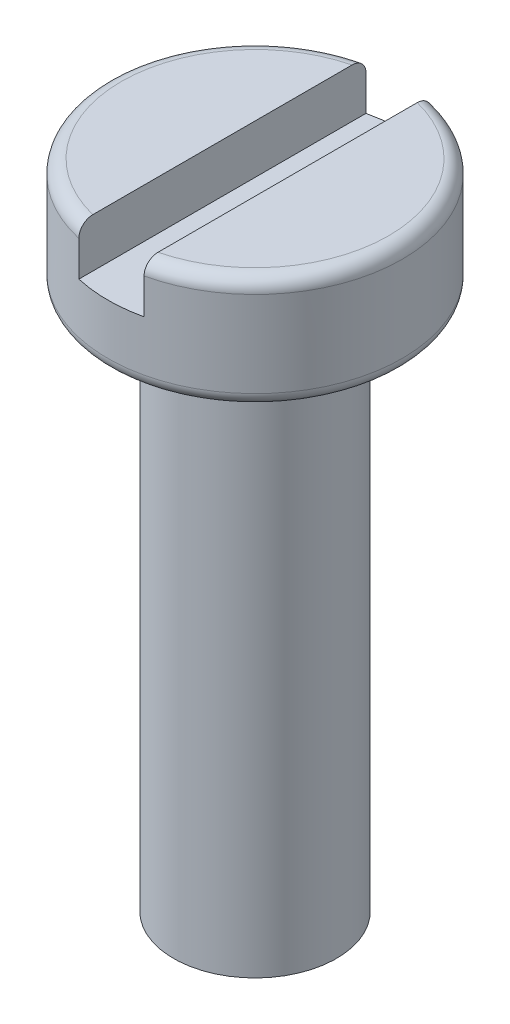
ISO-10303-21;
HEADER;
FILE_DESCRIPTION(('STEP AP214'),'2;1');
FILE_NAME('part.step','',(''),(''),'','','');
FILE_SCHEMA(('AUTOMOTIVE_DESIGN { 1 0 10303 214 1 1 1 1 }'));
ENDSEC;
DATA;
#1=APPLICATION_CONTEXT('core data for automotive mechanical design processes');
#2=APPLICATION_PROTOCOL_DEFINITION('international standard','automotive_design',2000,#1);
#3=PRODUCT_CONTEXT('',#1,'mechanical');
#4=PRODUCT('Part','Part','',(#3));
#5=PRODUCT_RELATED_PRODUCT_CATEGORY('part','',(#4));
#6=PRODUCT_DEFINITION_FORMATION('','',#4);
#7=PRODUCT_DEFINITION_CONTEXT('part definition',#1,'design');
#8=PRODUCT_DEFINITION('design','',#6,#7);
#9=PRODUCT_DEFINITION_SHAPE('','',#8);
#10=(LENGTH_UNIT() NAMED_UNIT(*) SI_UNIT(.MILLI.,.METRE.));
#11=(NAMED_UNIT(*) PLANE_ANGLE_UNIT() SI_UNIT($,.RADIAN.));
#12=(NAMED_UNIT(*) SI_UNIT($,.STERADIAN.) SOLID_ANGLE_UNIT());
#13=UNCERTAINTY_MEASURE_WITH_UNIT(LENGTH_MEASURE(1.E-05),#10,'distance_accuracy_value','');
#14=(GEOMETRIC_REPRESENTATION_CONTEXT(3) GLOBAL_UNCERTAINTY_ASSIGNED_CONTEXT((#13)) GLOBAL_UNIT_ASSIGNED_CONTEXT((#10,
#11,#12)) REPRESENTATION_CONTEXT('',''));
#15=CARTESIAN_POINT('',(0.,0.,0.));
#16=DIRECTION('',(0.,0.,1.));
#17=DIRECTION('',(1.,0.,0.));
#18=AXIS2_PLACEMENT_3D('',#15,#16,#17);
#19=CARTESIAN_POINT('',(0.,20.,0.));
#20=DIRECTION('',(0.,-1.,0.));
#21=DIRECTION('',(0.,0.,-1.));
#22=AXIS2_PLACEMENT_3D('',#19,#20,#21);
#23=PLANE('',#22);
#24=CARTESIAN_POINT('',(0.,20.,0.));
#25=DIRECTION('',(0.,-1.,0.));
#26=DIRECTION('',(0.,0.,-1.));
#27=AXIS2_PLACEMENT_3D('',#24,#25,#26);
#28=CIRCLE('',#27,2.46);
#29=CARTESIAN_POINT('',(-0.6,20.,-2.38570744224846));
#30=VERTEX_POINT('',#29);
#31=CARTESIAN_POINT('',(-0.6,20.,2.3857074422486));
#32=VERTEX_POINT('',#31);
#33=EDGE_CURVE('E104',#30,#32,#28,.F.);
#34=ORIENTED_EDGE('',*,*,#33,.T.);
#35=DIRECTION('',(0.,0.,1.));
#36=VECTOR('',#35,1.);
#37=CARTESIAN_POINT('',(-0.6,20.,2.71102334228302));
#38=LINE('',#37,#36);
#39=EDGE_CURVE('E101',#30,#32,#38,.T.);
#40=ORIENTED_EDGE('',*,*,#39,.F.);
#41=EDGE_LOOP('',(#34,#40));
#42=FACE_BOUND('',#41,.T.);
#43=ADVANCED_FACE('F35',(#42),#23,.F.);
#44=CARTESIAN_POINT('',(0.,19.75,0.));
#45=DIRECTION('',(0.,-1.,0.));
#46=DIRECTION('',(0.,0.,-1.));
#47=AXIS2_PLACEMENT_3D('',#44,#45,#46);
#48=TOROIDAL_SURFACE('',#47,2.46,0.25);
#49=CARTESIAN_POINT('',(-0.6,19.9057779269637,2.58686231688076));
#50=CARTESIAN_POINT('',(-0.6,19.8950398183509,2.5956435679496));
#51=CARTESIAN_POINT('',(-0.6,19.8835649113459,2.60353742344512));
#52=CARTESIAN_POINT('',(-0.6,19.8594480937063,2.61730071427246));
#53=CARTESIAN_POINT('',(-0.6,19.846805116745,2.62316827619331));
#54=CARTESIAN_POINT('',(-0.6,19.8207049337922,2.63268735414627));
#55=CARTESIAN_POINT('',(-0.6,19.8072475164309,2.63633829216775));
#56=CARTESIAN_POINT('',(-0.6,19.7799107452415,2.64130101178219));
#57=CARTESIAN_POINT('',(-0.6,19.7660314865879,2.64261331708466));
#58=CARTESIAN_POINT('',(-0.6,19.738395178757,2.64285617965291));
#59=CARTESIAN_POINT('',(-0.6,19.7246383380415,2.64181105425246));
#60=CARTESIAN_POINT('',(-0.6,19.6974964874994,2.6374228928476));
#61=CARTESIAN_POINT('',(-0.6,19.6841114783171,2.63407985286123));
#62=CARTESIAN_POINT('',(-0.6,19.6581028909833,2.62520726129129));
#63=CARTESIAN_POINT('',(-0.6,19.645478566111,2.61967989560636));
#64=CARTESIAN_POINT('',(-0.6,19.6213204884943,2.60661096468353));
#65=CARTESIAN_POINT('',(-0.6,19.609786785512,2.59906930759908));
#66=CARTESIAN_POINT('',(-0.6,19.5879670918565,2.58208635128699));
#67=CARTESIAN_POINT('',(-0.6,19.5776997639723,2.57262109024571));
#68=CARTESIAN_POINT('',(-0.6,19.5588555560857,2.55213651548936));
#69=CARTESIAN_POINT('',(-0.6,19.5502788528209,2.54111703950326));
#70=CARTESIAN_POINT('',(-0.6,19.5348419859735,2.51756279317136));
#71=CARTESIAN_POINT('',(-0.6,19.5280268479349,2.50499852227153));
#72=CARTESIAN_POINT('',(-0.6,19.5165412180445,2.47892562165189));
#73=CARTESIAN_POINT('',(-0.6,19.5118710171225,2.46541686411225));
#74=CARTESIAN_POINT('',(-0.6,19.5046834040679,2.43746147305775));
#75=CARTESIAN_POINT('',(-0.6,19.5022253760787,2.42299956182772));
#76=CARTESIAN_POINT('',(-0.6,19.4997225636304,2.39386809017465));
#77=CARTESIAN_POINT('',(-0.6,19.4996780748111,2.37919850453324));
#78=CARTESIAN_POINT('',(-0.6,19.5020180153436,2.3497740984476));
#79=CARTESIAN_POINT('',(-0.6,19.5044483852974,2.3350229106946));
#80=CARTESIAN_POINT('',(-0.6,19.5117449070815,2.30613455183196));
#81=CARTESIAN_POINT('',(-0.6,19.5166111916129,2.29199741421948));
#82=CARTESIAN_POINT('',(-0.6,19.5286718984968,2.26471817845948));
#83=CARTESIAN_POINT('',(-0.6,19.5358709457048,2.25157812149445));
#84=CARTESIAN_POINT('',(-0.6,19.5524143077675,2.22672417348261));
#85=CARTESIAN_POINT('',(-0.6,19.5617584549328,2.21501017106599));
#86=CARTESIAN_POINT('',(-0.6,19.5821446976601,2.19359931327809));
#87=CARTESIAN_POINT('',(-0.6,19.5931500850528,2.18386754370457));
#88=CARTESIAN_POINT('',(-0.6,19.6166881125292,2.16646889601282));
#89=CARTESIAN_POINT('',(-0.6,19.6292204309981,2.15880158414973));
#90=CARTESIAN_POINT('',(-0.6,19.654994143128,2.14603352411427));
#91=CARTESIAN_POINT('',(-0.6,19.6681962508577,2.14085347697661));
#92=CARTESIAN_POINT('',(-0.6,19.6952992227209,2.13286505733002));
#93=CARTESIAN_POINT('',(-0.6,19.7091999374493,2.13005617998664));
#94=CARTESIAN_POINT('',(-0.6,19.7368363949329,2.12696449025801));
#95=CARTESIAN_POINT('',(-0.6,19.7505636233152,2.12660516557791));
#96=CARTESIAN_POINT('',(-0.6,19.7778789014398,2.12822242302424));
#97=CARTESIAN_POINT('',(-0.6,19.7914669628874,2.13019880703996));
#98=CARTESIAN_POINT('',(-0.6,19.8179788523567,2.13638478002833));
#99=CARTESIAN_POINT('',(-0.6,19.8309079857046,2.14057171283409));
#100=CARTESIAN_POINT('',(-0.6,19.8558965522215,2.15102236109181));
#101=CARTESIAN_POINT('',(-0.6,19.8679559346654,2.15728619755261));
#102=CARTESIAN_POINT('',(-0.6,19.8910843669919,2.17180899084781));
#103=CARTESIAN_POINT('',(-0.6,19.9021337939875,2.18009916085056));
#104=CARTESIAN_POINT('',(-0.6,19.9227404635454,2.19836203634967));
#105=CARTESIAN_POINT('',(-0.6,19.9322974761134,2.20833500068789));
#106=CARTESIAN_POINT('',(-0.6,19.9499851160373,2.23003056226405));
#107=CARTESIAN_POINT('',(-0.6,19.958058183776,2.24180007994945));
#108=CARTESIAN_POINT('',(-0.6,19.972186772722,2.26649331028083));
#109=CARTESIAN_POINT('',(-0.6,19.9782419447608,2.27941722218843));
#110=CARTESIAN_POINT('',(-0.6,19.9883586493524,2.30650202512867));
#111=CARTESIAN_POINT('',(-0.6,19.9923493322226,2.32068941039095));
#112=CARTESIAN_POINT('',(-0.6,19.9979369938959,2.34952799110328));
#113=CARTESIAN_POINT('',(-0.6,19.9995337847543,2.36417922287773));
#114=CARTESIAN_POINT('',(-0.6,20.000296327843,2.39379345631476));
#115=CARTESIAN_POINT('',(-0.6,19.9994206262247,2.40875754873725));
#116=CARTESIAN_POINT('',(-0.6,19.9951594147004,2.43832912201416));
#117=CARTESIAN_POINT('',(-0.6,19.9917732700265,2.45293651171087));
#118=CARTESIAN_POINT('',(-0.6,19.9825823199898,2.48131275745753));
#119=CARTESIAN_POINT('',(-0.6,19.9767860479825,2.49508437744055));
#120=CARTESIAN_POINT('',(-0.6,19.9629195439454,2.5214172843565));
#121=CARTESIAN_POINT('',(-0.6,19.9548522718015,2.53398011833989));
#122=CARTESIAN_POINT('',(-0.6,19.9399012555252,2.55332109446276));
#123=CARTESIAN_POINT('',(-0.6,19.9336151471017,2.56056880475899));
#124=CARTESIAN_POINT('',(-0.6,19.9202625315426,2.57430626948078));
#125=CARTESIAN_POINT('',(-0.6,19.9131960419394,2.58079604092775));
#126=CARTESIAN_POINT('',(-0.6,19.9057779269637,2.58686231688076));
#127=B_SPLINE_CURVE_WITH_KNOTS('',3,(#49,#50,#51,#52,#53,#54,#55,#56,#57,#58,#59,#60,#61,#62,
#63,#64,#65,#66,#67,#68,#69,#70,#71,#72,#73,#74,#75,#76,#77,#78,#79,#80,#81,#82,#83,#84,#85,#86,
#87,#88,#89,#90,#91,#92,#93,#94,#95,#96,#97,#98,#99,#100,#101,#102,#103,#104,#105,#106,#107,
#108,#109,#110,#111,#112,#113,#114,#115,#116,#117,#118,#119,#120,#121,#122,#123,#124,#125,#126),
.UNSPECIFIED.,.T.,.F.,(4,2,2,2,2,2,2,2,2,2,2,2,2,2,2,2,2,2,2,2,2,2,2,2,2,2,2,2,2,2,2,2,2,2,2,2,
2,2,4),(0.,0.0415802938971037,0.083198928600957,0.124828411195371,0.166448570180792,
0.207641375076417,0.248834251353299,0.289986009055909,0.331139643494163,0.372841362924238,
0.414547439535753,0.457232632476987,0.499923613339573,0.543729095436656,0.587539943353091,
0.632179143563909,0.676820775845968,0.721551460228282,0.766278649058879,0.810132680496136,
0.853977490950431,0.896312268610293,0.938638030699984,0.979635425017785,1.02062934225808,
1.06121103910052,1.10179510081268,1.14304877711473,1.18430880471495,1.22693204392473,
1.26956265466308,1.3135726975485,1.35758619548361,1.40234198477537,1.44710909447208,
1.49171903241248,1.53627109549314,1.56499629658943,1.59372085246534),.UNSPECIFIED.);
#128=CARTESIAN_POINT('',(-0.6,19.75,2.64274478525649));
#129=VERTEX_POINT('',#128);
#130=EDGE_CURVE('E58',#32,#129,#127,.T.);
#131=ORIENTED_EDGE('',*,*,#130,.F.);
#132=ORIENTED_EDGE('',*,*,#33,.F.);
#133=CARTESIAN_POINT('',(-0.6,19.8944024686671,-2.17466848008618));
#134=CARTESIAN_POINT('',(-0.6,19.883309846262,-2.16652688736432));
#135=CARTESIAN_POINT('',(-0.6,19.8715393901536,-2.15929544056344));
#136=CARTESIAN_POINT('',(-0.6,19.8469488212528,-2.14689265741792));
#137=CARTESIAN_POINT('',(-0.6,19.8341278870049,-2.14172295221508));
#138=CARTESIAN_POINT('',(-0.6,19.8077853460394,-2.13362409480365));
#139=CARTESIAN_POINT('',(-0.6,19.794263294155,-2.13069638519483));
#140=CARTESIAN_POINT('',(-0.6,19.7669202433074,-2.12719403278441));
#141=CARTESIAN_POINT('',(-0.6,19.7530993134886,-2.12661885146695));
#142=CARTESIAN_POINT('',(-0.6,19.7257732920088,-2.12783146110016));
#143=CARTESIAN_POINT('',(-0.6,19.712266594452,-2.12958343059428));
#144=CARTESIAN_POINT('',(-0.6,19.6857384749176,-2.13532569735921));
#145=CARTESIAN_POINT('',(-0.6,19.6727170604,-2.13931602902404));
#146=CARTESIAN_POINT('',(-0.6,19.6474863404887,-2.1494105923049));
#147=CARTESIAN_POINT('',(-0.6,19.635279076258,-2.15551991523306));
#148=CARTESIAN_POINT('',(-0.6,19.6120284455293,-2.16965153318031));
#149=CARTESIAN_POINT('',(-0.6,19.6009852039983,-2.17767403329327));
#150=CARTESIAN_POINT('',(-0.6,19.5800642470021,-2.19561844754873));
#151=CARTESIAN_POINT('',(-0.6,19.5702241638525,-2.20558420676426));
#152=CARTESIAN_POINT('',(-0.6,19.5522879155651,-2.22697713536075));
#153=CARTESIAN_POINT('',(-0.6,19.5441920464871,-2.23840455231715));
#154=CARTESIAN_POINT('',(-0.6,19.5296784229926,-2.26282410847462));
#155=CARTESIAN_POINT('',(-0.6,19.5233291210497,-2.27585694646556));
#156=CARTESIAN_POINT('',(-0.6,19.5128429916506,-2.30278438881787));
#157=CARTESIAN_POINT('',(-0.6,19.5087065078549,-2.31667912666237));
#158=CARTESIAN_POINT('',(-0.6,19.5026635081991,-2.34533487622194));
#159=CARTESIAN_POINT('',(-0.6,19.500819560799,-2.36010911604456));
#160=CARTESIAN_POINT('',(-0.6,19.4996171492246,-2.38975919377417));
#161=CARTESIAN_POINT('',(-0.6,19.500258861375,-2.40463503881397));
#162=CARTESIAN_POINT('',(-0.6,19.5040358851863,-2.43418181941932));
#163=CARTESIAN_POINT('',(-0.6,19.5071898869517,-2.44885037722511));
#164=CARTESIAN_POINT('',(-0.6,19.5159467663178,-2.47743847402221));
#165=CARTESIAN_POINT('',(-0.6,19.5215495385545,-2.49135804521147));
#166=CARTESIAN_POINT('',(-0.6,19.5349828775226,-2.51785900108877));
#167=CARTESIAN_POINT('',(-0.6,19.5427846303755,-2.53045497621151));
#168=CARTESIAN_POINT('',(-0.6,19.5604427436654,-2.55411450413128));
#169=CARTESIAN_POINT('',(-0.6,19.5702988333929,-2.56517825851681));
#170=CARTESIAN_POINT('',(-0.6,19.5915255957485,-2.58516246124834));
#171=CARTESIAN_POINT('',(-0.6,19.6028525595357,-2.59412932678523));
#172=CARTESIAN_POINT('',(-0.6,19.6268844133151,-2.60997367876158));
#173=CARTESIAN_POINT('',(-0.6,19.639589089596,-2.61685148862899));
#174=CARTESIAN_POINT('',(-0.6,19.665659389012,-2.6281382460571));
#175=CARTESIAN_POINT('',(-0.6,19.6789992721377,-2.6326066819527));
#176=CARTESIAN_POINT('',(-0.6,19.7062466045649,-2.6391957173654));
#177=CARTESIAN_POINT('',(-0.6,19.7201539880588,-2.64131658831051));
#178=CARTESIAN_POINT('',(-0.6,19.7478812567646,-2.64312421655654));
#179=CARTESIAN_POINT('',(-0.6,19.7616984300182,-2.64285282687362));
#180=CARTESIAN_POINT('',(-0.6,19.7890887423948,-2.63998487487521));
#181=CARTESIAN_POINT('',(-0.6,19.8026618917013,-2.63738840981912));
#182=CARTESIAN_POINT('',(-0.6,19.8291322877508,-2.62996726244901));
#183=CARTESIAN_POINT('',(-0.6,19.8420317379529,-2.62515042644825));
#184=CARTESIAN_POINT('',(-0.6,19.8668513236063,-2.61344256334287));
#185=CARTESIAN_POINT('',(-0.6,19.8787714252024,-2.60655146457123));
#186=CARTESIAN_POINT('',(-0.6,19.901442031466,-2.59081746857535));
#187=CARTESIAN_POINT('',(-0.6,19.9121780352306,-2.58195369313075));
#188=CARTESIAN_POINT('',(-0.6,19.9320495300079,-2.56258513390767));
#189=CARTESIAN_POINT('',(-0.6,19.9411848615979,-2.55208018686957));
#190=CARTESIAN_POINT('',(-0.6,19.9578158880632,-2.52948107517064));
#191=CARTESIAN_POINT('',(-0.6,19.9652706100935,-2.51735676836809));
#192=CARTESIAN_POINT('',(-0.6,19.9780989930115,-2.49205357024425));
#193=CARTESIAN_POINT('',(-0.6,19.983472374073,-2.47887453740736));
#194=CARTESIAN_POINT('',(-0.6,19.9921323415263,-2.45146527387591));
#195=CARTESIAN_POINT('',(-0.6,19.9953602692204,-2.43721650353487));
#196=CARTESIAN_POINT('',(-0.6,19.9994319700037,-2.40838263421632));
#197=CARTESIAN_POINT('',(-0.6,20.0002755259457,-2.39379750472817));
#198=CARTESIAN_POINT('',(-0.6,19.999559832905,-2.36438314286838));
#199=CARTESIAN_POINT('',(-0.6,19.9979504524109,-2.34955511187288));
#200=CARTESIAN_POINT('',(-0.6,19.9922792732344,-2.3203705929169));
#201=CARTESIAN_POINT('',(-0.6,19.9882167164322,-2.3060142521724));
#202=CARTESIAN_POINT('',(-0.6,19.9777097480094,-2.27810596316031));
#203=CARTESIAN_POINT('',(-0.6,19.9712516736316,-2.2645591569393));
#204=CARTESIAN_POINT('',(-0.6,19.9561211900623,-2.23877753931798));
#205=CARTESIAN_POINT('',(-0.6,19.9474515009904,-2.22654114227506));
#206=CARTESIAN_POINT('',(-0.6,19.9313801864166,-2.20759176204346));
#207=CARTESIAN_POINT('',(-0.6,19.9245303985509,-2.20040383931934));
#208=CARTESIAN_POINT('',(-0.6,19.9100385586368,-2.1868758926182));
#209=CARTESIAN_POINT('',(-0.6,19.9023965328193,-2.18053584058426));
#210=CARTESIAN_POINT('',(-0.6,19.8944024686671,-2.17466848008618));
#211=B_SPLINE_CURVE_WITH_KNOTS('',3,(#133,#134,#135,#136,#137,#138,#139,#140,#141,#142,#143,
#144,#145,#146,#147,#148,#149,#150,#151,#152,#153,#154,#155,#156,#157,#158,#159,#160,#161,#162,
#163,#164,#165,#166,#167,#168,#169,#170,#171,#172,#173,#174,#175,#176,#177,#178,#179,#180,#181,
#182,#183,#184,#185,#186,#187,#188,#189,#190,#191,#192,#193,#194,#195,#196,#197,#198,#199,#200,
#201,#202,#203,#204,#205,#206,#207,#208,#209,#210),.UNSPECIFIED.,.T.,.F.,(4,2,2,2,2,2,2,2,2,2,2,
2,2,2,2,2,2,2,2,2,2,2,2,2,2,2,2,2,2,2,2,2,2,2,2,2,2,2,4),(0.,0.041244633660872,
0.0825218334872765,0.123825570637018,0.165119852443379,0.205785806789995,0.246452386014894,
0.287217359785701,0.327986705554893,0.369812851829636,0.411646092017453,0.454939786369004,
0.498240202472458,0.542698143433272,0.587159238152734,0.63195422432254,0.67674728327372,
0.720978707422788,0.765204306670547,0.808331228569678,0.851451470144276,0.893451661420113,
0.935446996080551,0.976709093215098,1.01796946441029,1.05908513509269,1.10020222650887,
1.14177714209757,1.18335619609043,1.22585974121034,1.26836899874418,1.31199731328668,
1.3556296009759,1.40016564967373,1.44471546866291,1.48952338396887,1.534276452409,
1.56400099805382,1.59372455983925),.UNSPECIFIED.);
#212=CARTESIAN_POINT('',(-0.6,19.75,-2.64274478525636));
#213=VERTEX_POINT('',#212);
#214=EDGE_CURVE('E94',#213,#30,#211,.T.);
#215=ORIENTED_EDGE('',*,*,#214,.F.);
#216=CARTESIAN_POINT('',(0.,19.75,0.));
#217=DIRECTION('',(0.,-1.,0.));
#218=DIRECTION('',(0.,0.,-1.));
#219=AXIS2_PLACEMENT_3D('',#216,#217,#218);
#220=CIRCLE('',#219,2.71);
#221=EDGE_CURVE('E109',#129,#213,#220,.T.);
#222=ORIENTED_EDGE('',*,*,#221,.F.);
#223=EDGE_LOOP('',(#131,#132,#215,#222));
#224=FACE_BOUND('',#223,.T.);
#225=ADVANCED_FACE('F153',(#224),#48,.T.);
#226=CARTESIAN_POINT('',(0.,8.,0.));
#227=DIRECTION('',(0.,1.,0.));
#228=DIRECTION('',(0.,0.,1.));
#229=AXIS2_PLACEMENT_3D('',#226,#227,#228);
#230=CYLINDRICAL_SURFACE('',#229,2.71);
#231=ORIENTED_EDGE('',*,*,#221,.T.);
#232=DIRECTION('',(0.,1.,0.));
#233=VECTOR('',#232,1.);
#234=CARTESIAN_POINT('',(-0.6,8.00000000000002,-2.64274478525643));
#235=LINE('',#234,#233);
#236=CARTESIAN_POINT('',(-0.6,19.1,-2.64274478525636));
#237=VERTEX_POINT('',#236);
#238=EDGE_CURVE('E175',#213,#237,#235,.F.);
#239=ORIENTED_EDGE('',*,*,#238,.T.);
#240=CARTESIAN_POINT('',(0.,19.1,0.));
#241=DIRECTION('',(0.,1.,0.));
#242=DIRECTION('',(0.,0.,1.));
#243=AXIS2_PLACEMENT_3D('',#240,#241,#242);
#244=CIRCLE('',#243,2.71);
#245=CARTESIAN_POINT('',(0.6,19.1,-2.64274478525636));
#246=VERTEX_POINT('',#245);
#247=EDGE_CURVE('E12',#246,#237,#244,.T.);
#248=ORIENTED_EDGE('',*,*,#247,.F.);
#249=DIRECTION('',(0.,1.,0.));
#250=VECTOR('',#249,1.);
#251=CARTESIAN_POINT('',(0.6,8.00000000000002,-2.64274478525643));
#252=LINE('',#251,#250);
#253=CARTESIAN_POINT('',(0.6,19.7500000000013,-2.64274478526424));
#254=VERTEX_POINT('',#253);
#255=EDGE_CURVE('E183',#246,#254,#252,.T.);
#256=ORIENTED_EDGE('',*,*,#255,.T.);
#257=CARTESIAN_POINT('',(0.6,19.75,2.64274478525649));
#258=VERTEX_POINT('',#257);
#259=EDGE_CURVE('E105',#254,#258,#220,.T.);
#260=ORIENTED_EDGE('',*,*,#259,.T.);
#261=DIRECTION('',(0.,1.,0.));
#262=VECTOR('',#261,1.);
#263=CARTESIAN_POINT('',(0.6,7.99999999999998,2.64274478525641));
#264=LINE('',#263,#262);
#265=CARTESIAN_POINT('',(0.6,19.1,2.64274478525648));
#266=VERTEX_POINT('',#265);
#267=EDGE_CURVE('E89',#258,#266,#264,.F.);
#268=ORIENTED_EDGE('',*,*,#267,.T.);
#269=CARTESIAN_POINT('',(-0.6,19.1,2.64274478525648));
#270=VERTEX_POINT('',#269);
#271=EDGE_CURVE('E39',#270,#266,#244,.T.);
#272=ORIENTED_EDGE('',*,*,#271,.F.);
#273=DIRECTION('',(0.,1.,0.));
#274=VECTOR('',#273,1.);
#275=CARTESIAN_POINT('',(-0.6,7.99999999999998,2.64274478525641));
#276=LINE('',#275,#274);
#277=EDGE_CURVE('E179',#270,#129,#276,.T.);
#278=ORIENTED_EDGE('',*,*,#277,.T.);
#279=EDGE_LOOP('',(#231,#239,#248,#256,#260,#268,#272,#278));
#280=FACE_BOUND('',#279,.T.);
#281=CARTESIAN_POINT('',(0.,18.17,0.));
#282=DIRECTION('',(0.,-1.,0.));
#283=DIRECTION('',(0.,0.,-1.));
#284=AXIS2_PLACEMENT_3D('',#281,#282,#283);
#285=CIRCLE('',#284,2.71);
#286=CARTESIAN_POINT('',(0.,18.17,-2.70999999999994));
#287=VERTEX_POINT('',#286);
#288=EDGE_CURVE('E188',#287,#287,#285,.F.);
#289=ORIENTED_EDGE('',*,*,#288,.T.);
#290=EDGE_LOOP('',(#289));
#291=FACE_BOUND('',#290,.T.);
#292=ADVANCED_FACE('F151',(#280,#291),#230,.T.);
#293=CARTESIAN_POINT('',(0.6,20.,2.3857074422486));
#294=VERTEX_POINT('',#293);
#295=CARTESIAN_POINT('',(0.6,20.,-2.38570744224846));
#296=VERTEX_POINT('',#295);
#297=EDGE_CURVE('E100',#294,#296,#28,.F.);
#298=ORIENTED_EDGE('',*,*,#297,.T.);
#299=DIRECTION('',(0.,0.,-1.));
#300=VECTOR('',#299,1.);
#301=CARTESIAN_POINT('',(0.6,20.,2.71102334228302));
#302=LINE('',#301,#300);
#303=EDGE_CURVE('E50',#294,#296,#302,.T.);
#304=ORIENTED_EDGE('',*,*,#303,.F.);
#305=EDGE_LOOP('',(#298,#304));
#306=FACE_BOUND('',#305,.T.);
#307=ADVANCED_FACE('F99',(#306),#23,.F.);
#308=CARTESIAN_POINT('',(0.,17.92,0.));
#309=DIRECTION('',(0.,-1.,0.));
#310=DIRECTION('',(0.,0.,-1.));
#311=AXIS2_PLACEMENT_3D('',#308,#309,#310);
#312=PLANE('',#311);
#313=CARTESIAN_POINT('',(0.,17.92,0.));
#314=DIRECTION('',(0.,-1.,0.));
#315=DIRECTION('',(0.,0.,-1.));
#316=AXIS2_PLACEMENT_3D('',#313,#314,#315);
#317=CIRCLE('',#316,1.65);
#318=CARTESIAN_POINT('',(0.,17.92,-1.64999999999994));
#319=VERTEX_POINT('',#318);
#320=EDGE_CURVE('E118',#319,#319,#317,.F.);
#321=ORIENTED_EDGE('',*,*,#320,.T.);
#322=EDGE_LOOP('',(#321));
#323=FACE_BOUND('',#322,.T.);
#324=CARTESIAN_POINT('',(0.,17.92,0.));
#325=DIRECTION('',(0.,-1.,0.));
#326=DIRECTION('',(0.,0.,-1.));
#327=AXIS2_PLACEMENT_3D('',#324,#325,#326);
#328=CIRCLE('',#327,2.46);
#329=CARTESIAN_POINT('',(0.,17.92,-2.45999999999994));
#330=VERTEX_POINT('',#329);
#331=EDGE_CURVE('E108',#330,#330,#328,.T.);
#332=ORIENTED_EDGE('',*,*,#331,.T.);
#333=EDGE_LOOP('',(#332));
#334=FACE_BOUND('',#333,.T.);
#335=ADVANCED_FACE('F142',(#323,#334),#312,.T.);
#336=CARTESIAN_POINT('',(0.,17.92,0.));
#337=DIRECTION('',(0.,-1.,0.));
#338=DIRECTION('',(0.,0.,-1.));
#339=AXIS2_PLACEMENT_3D('',#336,#337,#338);
#340=CYLINDRICAL_SURFACE('',#339,1.5);
#341=CARTESIAN_POINT('',(0.,17.77,0.));
#342=DIRECTION('',(0.,-1.,0.));
#343=DIRECTION('',(0.,0.,-1.));
#344=AXIS2_PLACEMENT_3D('',#341,#342,#343);
#345=CIRCLE('',#344,1.5);
#346=CARTESIAN_POINT('',(0.,17.77,-1.49999999999995));
#347=VERTEX_POINT('',#346);
#348=EDGE_CURVE('E115',#347,#347,#345,.T.);
#349=ORIENTED_EDGE('',*,*,#348,.T.);
#350=EDGE_LOOP('',(#349));
#351=FACE_BOUND('',#350,.T.);
#352=CARTESIAN_POINT('',(0.,8.,0.));
#353=DIRECTION('',(0.,-1.,0.));
#354=DIRECTION('',(0.,0.,-1.));
#355=AXIS2_PLACEMENT_3D('',#352,#353,#354);
#356=CIRCLE('',#355,1.5);
#357=CARTESIAN_POINT('',(0.,8.00000000000001,-1.50000000000001));
#358=VERTEX_POINT('',#357);
#359=EDGE_CURVE('E181',#358,#358,#356,.T.);
#360=ORIENTED_EDGE('',*,*,#359,.F.);
#361=EDGE_LOOP('',(#360));
#362=FACE_BOUND('',#361,.T.);
#363=ADVANCED_FACE('F137',(#351,#362),#340,.T.);
#364=CARTESIAN_POINT('',(0.,8.,0.));
#365=DIRECTION('',(0.,-1.,0.));
#366=DIRECTION('',(0.,0.,-1.));
#367=AXIS2_PLACEMENT_3D('',#364,#365,#366);
#368=PLANE('',#367);
#369=ORIENTED_EDGE('',*,*,#359,.T.);
#370=EDGE_LOOP('',(#369));
#371=FACE_BOUND('',#370,.T.);
#372=ADVANCED_FACE('F141',(#371),#368,.T.);
#373=CARTESIAN_POINT('',(0.6,19.9057779269637,2.58686231688076));
#374=CARTESIAN_POINT('',(0.6,19.9169025931632,2.57776327985589));
#375=CARTESIAN_POINT('',(0.6,19.9272527000197,2.56769785400049));
#376=CARTESIAN_POINT('',(0.6,19.9461122010159,2.54595309368041));
#377=CARTESIAN_POINT('',(0.6,19.9546187661238,2.53427132321102));
#378=CARTESIAN_POINT('',(0.6,19.9695520722048,2.50967246325872));
#379=CARTESIAN_POINT('',(0.6,19.9759821432381,2.4967573951484));
#380=CARTESIAN_POINT('',(0.6,19.986628146274,2.47005100990524));
#381=CARTESIAN_POINT('',(0.6,19.9908446414511,2.4562599166513));
#382=CARTESIAN_POINT('',(0.6,19.9970369963394,2.42789942410108));
#383=CARTESIAN_POINT('',(0.6,19.9989672167057,2.41332005783486));
#384=CARTESIAN_POINT('',(0.6,20.000399004893,2.38404134540786));
#385=CARTESIAN_POINT('',(0.6,19.9999001689155,2.36934197970425));
#386=CARTESIAN_POINT('',(0.6,19.9964620664074,2.33996916480795));
#387=CARTESIAN_POINT('',(0.6,19.9934801924616,2.32530068258425));
#388=CARTESIAN_POINT('',(0.6,19.9850964783542,2.29667109241443));
#389=CARTESIAN_POINT('',(0.6,19.9796945395019,2.2827100133422));
#390=CARTESIAN_POINT('',(0.6,19.9666059424516,2.25590716603894));
#391=CARTESIAN_POINT('',(0.6,19.9589200361884,2.24306503122227));
#392=CARTESIAN_POINT('',(0.6,19.9414563928667,2.21889013776512));
#393=CARTESIAN_POINT('',(0.6,19.9316788602527,2.20755723178169));
#394=CARTESIAN_POINT('',(0.6,19.9105254937946,2.18699962520666));
#395=CARTESIAN_POINT('',(0.6,19.8991890590445,2.17773442381394));
#396=CARTESIAN_POINT('',(0.6,19.8750742873265,2.16132135360425));
#397=CARTESIAN_POINT('',(0.6,19.8622962643812,2.15417302489164));
#398=CARTESIAN_POINT('',(0.6,19.8361430033382,2.14246442389688));
#399=CARTESIAN_POINT('',(0.6,19.8228045123803,2.13782205869663));
#400=CARTESIAN_POINT('',(0.6,19.7955250040227,2.13092034608472));
#401=CARTESIAN_POINT('',(0.6,19.7815841099168,2.12866051342263));
#402=CARTESIAN_POINT('',(0.6,19.7539410419268,2.12663860571753));
#403=CARTESIAN_POINT('',(0.6,19.7402441136823,2.12680418647436));
#404=CARTESIAN_POINT('',(0.6,19.7130767965782,2.12945106075111));
#405=CARTESIAN_POINT('',(0.6,19.6996063923996,2.13193219703183));
#406=CARTESIAN_POINT('',(0.6,19.6733683618953,2.13909636739112));
#407=CARTESIAN_POINT('',(0.6,19.6605964526621,2.14376376420775));
#408=CARTESIAN_POINT('',(0.6,19.6359964621806,2.15513746178243));
#409=CARTESIAN_POINT('',(0.6,19.6241684496797,2.1618439108812));
#410=CARTESIAN_POINT('',(0.6,19.601542619827,2.17722920089875));
#411=CARTESIAN_POINT('',(0.6,19.5907687327629,2.18594319676499));
#412=CARTESIAN_POINT('',(0.6,19.5707767489848,2.20500208607076));
#413=CARTESIAN_POINT('',(0.6,19.5615588986955,2.21534723733057));
#414=CARTESIAN_POINT('',(0.6,19.5446090167065,2.23774802957973));
#415=CARTESIAN_POINT('',(0.6,19.5369378372795,2.24984971468583));
#416=CARTESIAN_POINT('',(0.6,19.5236639771517,2.27513870448689));
#417=CARTESIAN_POINT('',(0.6,19.5180616451257,2.28832619172072));
#418=CARTESIAN_POINT('',(0.6,19.5089124037288,2.31585523933381));
#419=CARTESIAN_POINT('',(0.6,19.5054351383223,2.33021997799191));
#420=CARTESIAN_POINT('',(0.6,19.5009020956458,2.35932719775068));
#421=CARTESIAN_POINT('',(0.6,19.4998465754812,2.37406971879079));
#422=CARTESIAN_POINT('',(0.6,19.500191900761,2.40374444974833));
#423=CARTESIAN_POINT('',(0.6,19.5016291241333,2.41867625833318));
#424=CARTESIAN_POINT('',(0.6,19.5070052730212,2.4480835471559));
#425=CARTESIAN_POINT('',(0.6,19.5109441857128,2.46255902973257));
#426=CARTESIAN_POINT('',(0.6,19.5212025541868,2.49053982214567));
#427=CARTESIAN_POINT('',(0.6,19.5275070839278,2.50405059558232));
#428=CARTESIAN_POINT('',(0.6,19.5423437493798,2.52978919121932));
#429=CARTESIAN_POINT('',(0.6,19.5508756501157,2.54201714855893));
#430=CARTESIAN_POINT('',(0.6,19.5697308086526,2.56455203293997));
#431=CARTESIAN_POINT('',(0.6,19.5800108798647,2.57489507872222));
#432=CARTESIAN_POINT('',(0.6,19.6022035649378,2.59365023100117));
#433=CARTESIAN_POINT('',(0.6,19.6141159286871,2.60206263279815));
#434=CARTESIAN_POINT('',(0.6,19.6388907140877,2.61647986456498));
#435=CARTESIAN_POINT('',(0.6,19.6517190987736,2.62254319932373));
#436=CARTESIAN_POINT('',(0.6,19.6782260522056,2.63237633658921));
#437=CARTESIAN_POINT('',(0.6,19.6919044706715,2.63614654324103));
#438=CARTESIAN_POINT('',(0.6,19.7194094189198,2.64121297015998));
#439=CARTESIAN_POINT('',(0.6,19.7332265625517,2.6425602568666));
#440=CARTESIAN_POINT('',(0.6,19.7608928583866,2.64289385113037));
#441=CARTESIAN_POINT('',(0.6,19.774742016277,2.64187970079877));
#442=CARTESIAN_POINT('',(0.6,19.8019561619789,2.63754148316974));
#443=CARTESIAN_POINT('',(0.6,19.815324162739,2.63423619107647));
#444=CARTESIAN_POINT('',(0.6,19.8413082690277,2.62544269741125));
#445=CARTESIAN_POINT('',(0.6,19.8539252946826,2.61995723313255));
#446=CARTESIAN_POINT('',(0.6,19.8730332193186,2.60969009171426));
#447=CARTESIAN_POINT('',(0.6,19.8798865254629,2.60556723403541));
#448=CARTESIAN_POINT('',(0.6,19.8931656993693,2.59668329687964));
#449=CARTESIAN_POINT('',(0.6,19.8995915754082,2.59192222976658));
#450=CARTESIAN_POINT('',(0.6,19.9057779269637,2.58686231688076));
#451=B_SPLINE_CURVE_WITH_KNOTS('',3,(#373,#374,#375,#376,#377,#378,#379,#380,#381,#382,#383,
#384,#385,#386,#387,#388,#389,#390,#391,#392,#393,#394,#395,#396,#397,#398,#399,#400,#401,#402,
#403,#404,#405,#406,#407,#408,#409,#410,#411,#412,#413,#414,#415,#416,#417,#418,#419,#420,#421,
#422,#423,#424,#425,#426,#427,#428,#429,#430,#431,#432,#433,#434,#435,#436,#437,#438,#439,#440,
#441,#442,#443,#444,#445,#446,#447,#448,#449,#450),.UNSPECIFIED.,.T.,.F.,(4,2,2,2,2,2,2,2,2,2,2,
2,2,2,2,2,2,2,2,2,2,2,2,2,2,2,2,2,2,2,2,2,2,2,2,2,2,2,4),(0.,0.0430855035237854,
0.0862366635233199,0.129318274607084,0.172388919614342,0.216305594472259,0.260229570146706,
0.304923169830728,0.34961859229368,0.394299316262213,0.438975674939816,0.482680087516964,
0.526374998229287,0.56853498279318,0.610686378972844,0.651583128943029,0.692477101996985,
0.733082945051566,0.773691742881658,0.81507448531775,0.856463775275982,0.899254000364514,
0.942051433847857,0.986185237027289,1.03032372547284,1.07511178195504,1.11989960884705,
1.1644094698361,1.20891463718075,1.25244794006747,1.29597457990448,1.33833417215876,
1.38068629671607,1.42213483739557,1.46359141572345,1.50471222537862,1.54578156849128,
1.56974158940085,1.59370114620628),.UNSPECIFIED.);
#452=EDGE_CURVE('E85',#258,#294,#451,.T.);
#453=ORIENTED_EDGE('',*,*,#452,.F.);
#454=ORIENTED_EDGE('',*,*,#259,.F.);
#455=CARTESIAN_POINT('',(0.6,19.8944024686671,-2.17466848008618));
#456=CARTESIAN_POINT('',(0.6,19.9060570400945,-2.18322407893569));
#457=CARTESIAN_POINT('',(0.6,19.9169803248193,-2.19279758526086));
#458=CARTESIAN_POINT('',(0.6,19.9370611188982,-2.21366339300844));
#459=CARTESIAN_POINT('',(0.6,19.9462156765038,-2.22495851231939));
#460=CARTESIAN_POINT('',(0.6,19.9625027797233,-2.24889217502332));
#461=CARTESIAN_POINT('',(0.6,19.9696390209244,-2.2615282040408));
#462=CARTESIAN_POINT('',(0.6,19.9817402400606,-2.28779372765297));
#463=CARTESIAN_POINT('',(0.6,19.9867058285108,-2.30142294164593));
#464=CARTESIAN_POINT('',(0.6,19.994440068445,-2.32962016359587));
#465=CARTESIAN_POINT('',(0.6,19.9971570709489,-2.34420235461865));
#466=CARTESIAN_POINT('',(0.6,20.0001358276639,-2.37361704300086));
#467=CARTESIAN_POINT('',(0.6,20.0003972219943,-2.38844957673009));
#468=CARTESIAN_POINT('',(0.6,19.9984385076856,-2.41812153190812));
#469=CARTESIAN_POINT('',(0.6,19.9961900233632,-2.43295909723152));
#470=CARTESIAN_POINT('',(0.6,19.9892108448965,-2.4620395481522));
#471=CARTESIAN_POINT('',(0.6,19.9844802137733,-2.47628244883796));
#472=CARTESIAN_POINT('',(0.6,19.9727028760047,-2.50362058722193));
#473=CARTESIAN_POINT('',(0.6,19.9656780879161,-2.51672525526337));
#474=CARTESIAN_POINT('',(0.6,19.9494778455635,-2.54153104070058));
#475=CARTESIAN_POINT('',(0.6,19.9403026547957,-2.55323232979184));
#476=CARTESIAN_POINT('',(0.6,19.9202884054529,-2.57460188991214));
#477=CARTESIAN_POINT('',(0.6,19.9094933420055,-2.58431135240996));
#478=CARTESIAN_POINT('',(0.6,19.8863882309249,-2.60172032836337));
#479=CARTESIAN_POINT('',(0.6,19.8740784175532,-2.60942015204339));
#480=CARTESIAN_POINT('',(0.6,19.8486463685603,-2.62237743443215));
#481=CARTESIAN_POINT('',(0.6,19.8355544254919,-2.62769437342539));
#482=CARTESIAN_POINT('',(0.6,19.8086529489945,-2.63600505557404));
#483=CARTESIAN_POINT('',(0.6,19.7948435066925,-2.63899909298638));
#484=CARTESIAN_POINT('',(0.6,19.7671891401196,-2.64252920065069));
#485=CARTESIAN_POINT('',(0.6,19.7533501846242,-2.64311216803087));
#486=CARTESIAN_POINT('',(0.6,19.7257734102776,-2.64193029103051));
#487=CARTESIAN_POINT('',(0.6,19.7120355857688,-2.64016557900829));
#488=CARTESIAN_POINT('',(0.6,19.6851388628416,-2.63436414671132));
#489=CARTESIAN_POINT('',(0.6,19.6719768948774,-2.63034162727624));
#490=CARTESIAN_POINT('',(0.6,19.6465067528842,-2.62016231911069));
#491=CARTESIAN_POINT('',(0.6,19.6341985977152,-2.61400548325303));
#492=CARTESIAN_POINT('',(0.6,19.6106656855043,-2.59968533150608));
#493=CARTESIAN_POINT('',(0.6,19.5994511971851,-2.59150515482894));
#494=CARTESIAN_POINT('',(0.6,19.5785198481135,-2.573413324907));
#495=CARTESIAN_POINT('',(0.6,19.5688031198337,-2.56350151866972));
#496=CARTESIAN_POINT('',(0.6,19.5509245595677,-2.54201310810556));
#497=CARTESIAN_POINT('',(0.6,19.542798990086,-2.53040634560003));
#498=CARTESIAN_POINT('',(0.6,19.5285537443924,-2.50602163111241));
#499=CARTESIAN_POINT('',(0.6,19.5224343263039,-2.49324352868928));
#500=CARTESIAN_POINT('',(0.6,19.5122063343919,-2.46652106947608));
#501=CARTESIAN_POINT('',(0.6,19.5081546969006,-2.45255491723692));
#502=CARTESIAN_POINT('',(0.6,19.5023959961974,-2.4241472778217));
#503=CARTESIAN_POINT('',(0.6,19.5006892446479,-2.40970572772093));
#504=CARTESIAN_POINT('',(0.6,19.4996397433858,-2.38040959111145));
#505=CARTESIAN_POINT('',(0.6,19.5003512502473,-2.3655530420643));
#506=CARTESIAN_POINT('',(0.6,19.5042345418162,-2.33616415270226));
#507=CARTESIAN_POINT('',(0.6,19.5074065341372,-2.32163183985258));
#508=CARTESIAN_POINT('',(0.6,19.5161699948991,-2.29317473056145));
#509=CARTESIAN_POINT('',(0.6,19.521782435842,-2.2792563789088));
#510=CARTESIAN_POINT('',(0.6,19.535291702791,-2.25257458581238));
#511=CARTESIAN_POINT('',(0.6,19.5431884729361,-2.23981111613708));
#512=CARTESIAN_POINT('',(0.6,19.5609566202444,-2.21598100865319));
#513=CARTESIAN_POINT('',(0.6,19.5708028509134,-2.2048956453758));
#514=CARTESIAN_POINT('',(0.6,19.5922695908807,-2.18459992533316));
#515=CARTESIAN_POINT('',(0.6,19.6038897961554,-2.17538924791429));
#516=CARTESIAN_POINT('',(0.6,19.6281949261132,-2.15941612419893));
#517=CARTESIAN_POINT('',(0.6,19.6408359719508,-2.15258694443165));
#518=CARTESIAN_POINT('',(0.6,19.6671143999394,-2.14123667186962));
#519=CARTESIAN_POINT('',(0.6,19.6807515084726,-2.13671494792317));
#520=CARTESIAN_POINT('',(0.6,19.7081218578869,-2.13026324952045));
#521=CARTESIAN_POINT('',(0.6,19.7218350953147,-2.12824824737505));
#522=CARTESIAN_POINT('',(0.6,19.7494073354562,-2.12659809551568));
#523=CARTESIAN_POINT('',(0.6,19.7632663568098,-2.12696325391353));
#524=CARTESIAN_POINT('',(0.6,19.7904617126021,-2.13003104072805));
#525=CARTESIAN_POINT('',(0.6,19.8038029723233,-2.13269054463269));
#526=CARTESIAN_POINT('',(0.6,19.8298426311236,-2.14019479291303));
#527=CARTESIAN_POINT('',(0.6,19.8425418141583,-2.14503679717482));
#528=CARTESIAN_POINT('',(0.6,19.8617102081237,-2.15421851591737));
#529=CARTESIAN_POINT('',(0.6,19.8685125722415,-2.15788075940237));
#530=CARTESIAN_POINT('',(0.6,19.8817469474741,-2.16582142405663));
#531=CARTESIAN_POINT('',(0.6,19.8881789719767,-2.17009982293254));
#532=CARTESIAN_POINT('',(0.6,19.8944024686671,-2.17466848008618));
#533=B_SPLINE_CURVE_WITH_KNOTS('',3,(#455,#456,#457,#458,#459,#460,#461,#462,#463,#464,#465,
#466,#467,#468,#469,#470,#471,#472,#473,#474,#475,#476,#477,#478,#479,#480,#481,#482,#483,#484,
#485,#486,#487,#488,#489,#490,#491,#492,#493,#494,#495,#496,#497,#498,#499,#500,#501,#502,#503,
#504,#505,#506,#507,#508,#509,#510,#511,#512,#513,#514,#515,#516,#517,#518,#519,#520,#521,#522,
#523,#524,#525,#526,#527,#528,#529,#530,#531,#532),.UNSPECIFIED.,.T.,.F.,(4,2,2,2,2,2,2,2,2,2,2,
2,2,2,2,2,2,2,2,2,2,2,2,2,2,2,2,2,2,2,2,2,2,2,2,2,2,2,4),(0.,0.0433440285060391,
0.0867597786549024,0.130095511088372,0.173419047117662,0.217712064392678,0.262011572912983,
0.306817032206702,0.3516213539565,0.396009556457493,0.440392322760467,0.483735755242152,
0.527072492911341,0.569257294875506,0.611436752145796,0.652791813664912,0.69414454375252,
0.735240047700854,0.776336459124293,0.817787606267617,0.859242417545618,0.901553492425488,
0.943870009162313,0.987296155101078,1.03072807231751,1.07514081058416,1.11955729676431,
1.16436327162598,1.20916815089285,1.25342887261887,1.29768201744366,1.34057062241628,
1.38344748989638,1.42482638848863,1.46621064368623,1.50683357935072,1.54740565465392,
1.57055203781484,1.59369758371812),.UNSPECIFIED.);
#534=EDGE_CURVE('E95',#296,#254,#533,.T.);
#535=ORIENTED_EDGE('',*,*,#534,.F.);
#536=ORIENTED_EDGE('',*,*,#297,.F.);
#537=EDGE_LOOP('',(#453,#454,#535,#536));
#538=FACE_BOUND('',#537,.T.);
#539=ADVANCED_FACE('F103',(#538),#48,.T.);
#540=CARTESIAN_POINT('',(0.,18.17,0.));
#541=DIRECTION('',(0.,-1.,0.));
#542=DIRECTION('',(0.,0.,-1.));
#543=AXIS2_PLACEMENT_3D('',#540,#541,#542);
#544=TOROIDAL_SURFACE('',#543,2.46,0.25);
#545=ORIENTED_EDGE('',*,*,#288,.F.);
#546=EDGE_LOOP('',(#545));
#547=FACE_BOUND('',#546,.T.);
#548=ORIENTED_EDGE('',*,*,#331,.F.);
#549=EDGE_LOOP('',(#548));
#550=FACE_BOUND('',#549,.T.);
#551=ADVANCED_FACE('F205',(#547,#550),#544,.T.);
#552=CARTESIAN_POINT('',(0.,17.77,0.));
#553=DIRECTION('',(0.,-1.,0.));
#554=DIRECTION('',(0.,0.,-1.));
#555=AXIS2_PLACEMENT_3D('',#552,#553,#554);
#556=TOROIDAL_SURFACE('',#555,1.65,0.15);
#557=ORIENTED_EDGE('',*,*,#320,.F.);
#558=EDGE_LOOP('',(#557));
#559=FACE_BOUND('',#558,.T.);
#560=ORIENTED_EDGE('',*,*,#348,.F.);
#561=EDGE_LOOP('',(#560));
#562=FACE_BOUND('',#561,.T.);
#563=ADVANCED_FACE('F37',(#559,#562),#556,.F.);
#564=CARTESIAN_POINT('',(0.,19.1,0.));
#565=DIRECTION('',(0.,1.,0.));
#566=DIRECTION('',(0.,0.,1.));
#567=AXIS2_PLACEMENT_3D('',#564,#565,#566);
#568=PLANE('',#567);
#569=ORIENTED_EDGE('',*,*,#247,.T.);
#570=DIRECTION('',(0.,0.,1.));
#571=VECTOR('',#570,1.);
#572=CARTESIAN_POINT('',(-0.6,19.1,2.71102334228301));
#573=LINE('',#572,#571);
#574=EDGE_CURVE('E177',#237,#270,#573,.T.);
#575=ORIENTED_EDGE('',*,*,#574,.T.);
#576=ORIENTED_EDGE('',*,*,#271,.T.);
#577=DIRECTION('',(0.,0.,-1.));
#578=VECTOR('',#577,1.);
#579=CARTESIAN_POINT('',(0.6,19.1,2.71102334228301));
#580=LINE('',#579,#578);
#581=EDGE_CURVE('E195',#266,#246,#580,.T.);
#582=ORIENTED_EDGE('',*,*,#581,.T.);
#583=EDGE_LOOP('',(#569,#575,#576,#582));
#584=FACE_BOUND('',#583,.T.);
#585=ADVANCED_FACE('F193',(#584),#568,.T.);
#586=CARTESIAN_POINT('',(-0.6,19.1,2.71102334228301));
#587=DIRECTION('',(-1.,0.,0.));
#588=DIRECTION('',(0.,0.,-1.));
#589=AXIS2_PLACEMENT_3D('',#586,#587,#588);
#590=PLANE('',#589);
#591=ORIENTED_EDGE('',*,*,#574,.F.);
#592=ORIENTED_EDGE('',*,*,#238,.F.);
#593=ORIENTED_EDGE('',*,*,#214,.T.);
#594=ORIENTED_EDGE('',*,*,#39,.T.);
#595=ORIENTED_EDGE('',*,*,#130,.T.);
#596=ORIENTED_EDGE('',*,*,#277,.F.);
#597=EDGE_LOOP('',(#591,#592,#593,#594,#595,#596));
#598=FACE_BOUND('',#597,.T.);
#599=ADVANCED_FACE('F134',(#598),#590,.F.);
#600=CARTESIAN_POINT('',(0.6,19.1,2.71102334228301));
#601=DIRECTION('',(1.,0.,0.));
#602=DIRECTION('',(0.,0.,1.));
#603=AXIS2_PLACEMENT_3D('',#600,#601,#602);
#604=PLANE('',#603);
#605=ORIENTED_EDGE('',*,*,#452,.T.);
#606=ORIENTED_EDGE('',*,*,#303,.T.);
#607=ORIENTED_EDGE('',*,*,#534,.T.);
#608=ORIENTED_EDGE('',*,*,#255,.F.);
#609=ORIENTED_EDGE('',*,*,#581,.F.);
#610=ORIENTED_EDGE('',*,*,#267,.F.);
#611=EDGE_LOOP('',(#605,#606,#607,#608,#609,#610));
#612=FACE_BOUND('',#611,.T.);
#613=ADVANCED_FACE('F86',(#612),#604,.F.);
#614=CLOSED_SHELL('',(#43,#225,#292,#307,#335,#363,#372,#539,#551,#563,#585,#599,#613));
#615=MANIFOLD_SOLID_BREP('B2',#614);
#616=ADVANCED_BREP_SHAPE_REPRESENTATION('',(#18,#615),#14);
#617=SHAPE_DEFINITION_REPRESENTATION(#9,#616);
ENDSEC;
END-ISO-10303-21;
